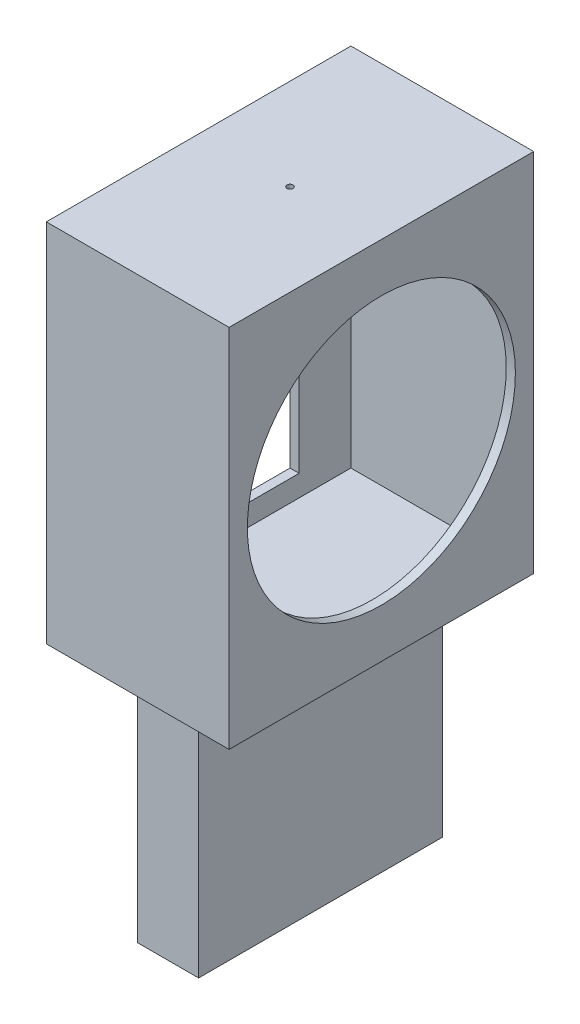
ISO-10303-21;
HEADER;
FILE_DESCRIPTION(('STEP AP214'),'2;1');
FILE_NAME('part.step','',(''),(''),'','','');
FILE_SCHEMA(('AUTOMOTIVE_DESIGN { 1 0 10303 214 1 1 1 1 }'));
ENDSEC;
DATA;
#1=APPLICATION_CONTEXT('core data for automotive mechanical design processes');
#2=APPLICATION_PROTOCOL_DEFINITION('international standard','automotive_design',2000,#1);
#3=PRODUCT_CONTEXT('',#1,'mechanical');
#4=PRODUCT('Part','Part','',(#3));
#5=PRODUCT_RELATED_PRODUCT_CATEGORY('part','',(#4));
#6=PRODUCT_DEFINITION_FORMATION('','',#4);
#7=PRODUCT_DEFINITION_CONTEXT('part definition',#1,'design');
#8=PRODUCT_DEFINITION('design','',#6,#7);
#9=PRODUCT_DEFINITION_SHAPE('','',#8);
#10=(LENGTH_UNIT() NAMED_UNIT(*) SI_UNIT(.MILLI.,.METRE.));
#11=(NAMED_UNIT(*) PLANE_ANGLE_UNIT() SI_UNIT($,.RADIAN.));
#12=(NAMED_UNIT(*) SI_UNIT($,.STERADIAN.) SOLID_ANGLE_UNIT());
#13=UNCERTAINTY_MEASURE_WITH_UNIT(LENGTH_MEASURE(1.E-05),#10,'distance_accuracy_value','');
#14=(GEOMETRIC_REPRESENTATION_CONTEXT(3) GLOBAL_UNCERTAINTY_ASSIGNED_CONTEXT((#13)) GLOBAL_UNIT_ASSIGNED_CONTEXT((#10,
#11,#12)) REPRESENTATION_CONTEXT('',''));
#15=CARTESIAN_POINT('',(0.,0.,0.));
#16=DIRECTION('',(0.,0.,1.));
#17=DIRECTION('',(1.,0.,0.));
#18=AXIS2_PLACEMENT_3D('',#15,#16,#17);
#19=CARTESIAN_POINT('',(138.,0.,40.));
#20=DIRECTION('',(0.,0.,-1.));
#21=DIRECTION('',(-1.,0.,0.));
#22=AXIS2_PLACEMENT_3D('',#19,#20,#21);
#23=PLANE('',#22);
#24=DIRECTION('',(0.,-1.,0.));
#25=VECTOR('',#24,1.);
#26=CARTESIAN_POINT('',(118.,0.,40.));
#27=LINE('',#26,#25);
#28=CARTESIAN_POINT('',(118.,80.,40.));
#29=VERTEX_POINT('',#28);
#30=CARTESIAN_POINT('',(118.,0.,40.));
#31=VERTEX_POINT('',#30);
#32=EDGE_CURVE('E114',#29,#31,#27,.T.);
#33=ORIENTED_EDGE('',*,*,#32,.T.);
#34=DIRECTION('',(-1.,0.,0.));
#35=VECTOR('',#34,1.);
#36=CARTESIAN_POINT('',(138.,0.,40.));
#37=LINE('',#36,#35);
#38=CARTESIAN_POINT('',(138.,0.,40.));
#39=VERTEX_POINT('',#38);
#40=EDGE_CURVE('E12',#39,#31,#37,.T.);
#41=ORIENTED_EDGE('',*,*,#40,.F.);
#42=DIRECTION('',(0.,-1.,0.));
#43=VECTOR('',#42,1.);
#44=CARTESIAN_POINT('',(138.,0.,40.));
#45=LINE('',#44,#43);
#46=CARTESIAN_POINT('',(138.,80.,40.));
#47=VERTEX_POINT('',#46);
#48=EDGE_CURVE('E102',#47,#39,#45,.T.);
#49=ORIENTED_EDGE('',*,*,#48,.F.);
#50=DIRECTION('',(-1.,0.,0.));
#51=VECTOR('',#50,1.);
#52=CARTESIAN_POINT('',(138.,80.,40.));
#53=LINE('',#52,#51);
#54=EDGE_CURVE('E110',#47,#29,#53,.T.);
#55=ORIENTED_EDGE('',*,*,#54,.T.);
#56=EDGE_LOOP('',(#33,#41,#49,#55));
#57=FACE_BOUND('',#56,.T.);
#58=ADVANCED_FACE('F51',(#57),#23,.F.);
#59=CARTESIAN_POINT('',(138.,0.,-40.));
#60=DIRECTION('',(0.,1.,0.));
#61=DIRECTION('',(0.,0.,1.));
#62=AXIS2_PLACEMENT_3D('',#59,#60,#61);
#63=PLANE('',#62);
#64=DIRECTION('',(0.,0.,-1.));
#65=VECTOR('',#64,1.);
#66=CARTESIAN_POINT('',(118.,0.,-40.));
#67=LINE('',#66,#65);
#68=CARTESIAN_POINT('',(118.,0.,-40.));
#69=VERTEX_POINT('',#68);
#70=EDGE_CURVE('E106',#31,#69,#67,.T.);
#71=ORIENTED_EDGE('',*,*,#70,.T.);
#72=DIRECTION('',(-1.,0.,0.));
#73=VECTOR('',#72,1.);
#74=CARTESIAN_POINT('',(138.,0.,-40.));
#75=LINE('',#74,#73);
#76=CARTESIAN_POINT('',(138.,0.,-40.));
#77=VERTEX_POINT('',#76);
#78=EDGE_CURVE('E59',#77,#69,#75,.T.);
#79=ORIENTED_EDGE('',*,*,#78,.F.);
#80=DIRECTION('',(0.,0.,-1.));
#81=VECTOR('',#80,1.);
#82=CARTESIAN_POINT('',(138.,0.,-40.));
#83=LINE('',#82,#81);
#84=EDGE_CURVE('E97',#39,#77,#83,.T.);
#85=ORIENTED_EDGE('',*,*,#84,.F.);
#86=ORIENTED_EDGE('',*,*,#40,.T.);
#87=EDGE_LOOP('',(#71,#79,#85,#86));
#88=FACE_BOUND('',#87,.T.);
#89=ADVANCED_FACE('F105',(#88),#63,.F.);
#90=CARTESIAN_POINT('',(138.,0.,-40.));
#91=DIRECTION('',(0.,0.,1.));
#92=DIRECTION('',(1.,0.,0.));
#93=AXIS2_PLACEMENT_3D('',#90,#91,#92);
#94=PLANE('',#93);
#95=DIRECTION('',(0.,1.,0.));
#96=VECTOR('',#95,1.);
#97=CARTESIAN_POINT('',(118.,0.,-40.));
#98=LINE('',#97,#96);
#99=CARTESIAN_POINT('',(118.,80.,-40.));
#100=VERTEX_POINT('',#99);
#101=EDGE_CURVE('E84',#69,#100,#98,.T.);
#102=ORIENTED_EDGE('',*,*,#101,.T.);
#103=DIRECTION('',(-1.,0.,0.));
#104=VECTOR('',#103,1.);
#105=CARTESIAN_POINT('',(138.,80.,-40.));
#106=LINE('',#105,#104);
#107=CARTESIAN_POINT('',(138.,80.,-40.));
#108=VERTEX_POINT('',#107);
#109=EDGE_CURVE('E107',#108,#100,#106,.T.);
#110=ORIENTED_EDGE('',*,*,#109,.F.);
#111=DIRECTION('',(0.,1.,0.));
#112=VECTOR('',#111,1.);
#113=CARTESIAN_POINT('',(138.,0.,-40.));
#114=LINE('',#113,#112);
#115=EDGE_CURVE('E100',#77,#108,#114,.T.);
#116=ORIENTED_EDGE('',*,*,#115,.F.);
#117=ORIENTED_EDGE('',*,*,#78,.T.);
#118=EDGE_LOOP('',(#102,#110,#116,#117));
#119=FACE_BOUND('',#118,.T.);
#120=ADVANCED_FACE('F108',(#119),#94,.F.);
#121=CARTESIAN_POINT('',(138.,80.,-40.));
#122=DIRECTION('',(0.,-1.,0.));
#123=DIRECTION('',(0.,0.,-1.));
#124=AXIS2_PLACEMENT_3D('',#121,#122,#123);
#125=PLANE('',#124);
#126=DIRECTION('',(0.,0.,1.));
#127=VECTOR('',#126,1.);
#128=CARTESIAN_POINT('',(118.,80.,-40.));
#129=LINE('',#128,#127);
#130=EDGE_CURVE('E90',#100,#29,#129,.T.);
#131=ORIENTED_EDGE('',*,*,#130,.T.);
#132=ORIENTED_EDGE('',*,*,#54,.F.);
#133=DIRECTION('',(0.,0.,1.));
#134=VECTOR('',#133,1.);
#135=CARTESIAN_POINT('',(138.,80.,-40.));
#136=LINE('',#135,#134);
#137=EDGE_CURVE('E67',#108,#47,#136,.T.);
#138=ORIENTED_EDGE('',*,*,#137,.F.);
#139=ORIENTED_EDGE('',*,*,#109,.T.);
#140=EDGE_LOOP('',(#131,#132,#138,#139));
#141=FACE_BOUND('',#140,.T.);
#142=ADVANCED_FACE('F121',(#141),#125,.F.);
#143=CARTESIAN_POINT('',(138.,0.,0.));
#144=DIRECTION('',(1.,0.,0.));
#145=DIRECTION('',(0.,0.,-1.));
#146=AXIS2_PLACEMENT_3D('',#143,#144,#145);
#147=PLANE('',#146);
#148=ORIENTED_EDGE('',*,*,#48,.T.);
#149=ORIENTED_EDGE('',*,*,#84,.T.);
#150=ORIENTED_EDGE('',*,*,#115,.T.);
#151=ORIENTED_EDGE('',*,*,#137,.T.);
#152=EDGE_LOOP('',(#148,#149,#150,#151));
#153=FACE_BOUND('',#152,.T.);
#154=ADVANCED_FACE('F98',(#153),#147,.T.);
#155=CARTESIAN_POINT('',(118.,0.,0.));
#156=DIRECTION('',(1.,0.,0.));
#157=DIRECTION('',(0.,0.,-1.));
#158=AXIS2_PLACEMENT_3D('',#155,#156,#157);
#159=PLANE('',#158);
#160=ORIENTED_EDGE('',*,*,#32,.F.);
#161=ORIENTED_EDGE('',*,*,#130,.F.);
#162=ORIENTED_EDGE('',*,*,#101,.F.);
#163=ORIENTED_EDGE('',*,*,#70,.F.);
#164=EDGE_LOOP('',(#160,#161,#162,#163));
#165=FACE_BOUND('',#164,.T.);
#166=ADVANCED_FACE('F124',(#165),#159,.F.);
#167=CLOSED_SHELL('',(#58,#89,#120,#142,#154,#166));
#168=MANIFOLD_SOLID_BREP('B2',#167);
#169=CARTESIAN_POINT('',(101.,0.,0.));
#170=DIRECTION('',(1.,0.,0.));
#171=DIRECTION('',(0.,0.,-1.));
#172=AXIS2_PLACEMENT_3D('',#169,#170,#171);
#173=PLANE('',#172);
#174=DIRECTION('',(0.,-1.,0.));
#175=VECTOR('',#174,1.);
#176=CARTESIAN_POINT('',(101.,83.,47.));
#177=LINE('',#176,#175);
#178=CARTESIAN_POINT('',(101.,197.,47.));
#179=VERTEX_POINT('',#178);
#180=CARTESIAN_POINT('',(101.,83.,47.));
#181=VERTEX_POINT('',#180);
#182=EDGE_CURVE('E310',#179,#181,#177,.T.);
#183=ORIENTED_EDGE('',*,*,#182,.T.);
#184=DIRECTION('',(0.,0.,-1.));
#185=VECTOR('',#184,1.);
#186=CARTESIAN_POINT('',(101.,83.,-47.));
#187=LINE('',#186,#185);
#188=CARTESIAN_POINT('',(101.,83.,-47.));
#189=VERTEX_POINT('',#188);
#190=EDGE_CURVE('E324',#181,#189,#187,.T.);
#191=ORIENTED_EDGE('',*,*,#190,.T.);
#192=DIRECTION('',(0.,1.,0.));
#193=VECTOR('',#192,1.);
#194=CARTESIAN_POINT('',(101.,83.,-47.));
#195=LINE('',#194,#193);
#196=CARTESIAN_POINT('',(101.,197.,-47.));
#197=VERTEX_POINT('',#196);
#198=EDGE_CURVE('E326',#189,#197,#195,.T.);
#199=ORIENTED_EDGE('',*,*,#198,.T.);
#200=DIRECTION('',(0.,0.,1.));
#201=VECTOR('',#200,1.);
#202=CARTESIAN_POINT('',(101.,197.,-47.));
#203=LINE('',#202,#201);
#204=EDGE_CURVE('E315',#197,#179,#203,.T.);
#205=ORIENTED_EDGE('',*,*,#204,.T.);
#206=EDGE_LOOP('',(#183,#191,#199,#205));
#207=FACE_BOUND('',#206,.T.);
#208=DIRECTION('',(0.,0.,1.));
#209=VECTOR('',#208,1.);
#210=CARTESIAN_POINT('',(101.,90.,0.));
#211=LINE('',#210,#209);
#212=CARTESIAN_POINT('',(101.,90.,-30.));
#213=VERTEX_POINT('',#212);
#214=CARTESIAN_POINT('',(101.,90.,30.));
#215=VERTEX_POINT('',#214);
#216=EDGE_CURVE('E184',#213,#215,#211,.T.);
#217=ORIENTED_EDGE('',*,*,#216,.T.);
#218=DIRECTION('',(0.,1.,0.));
#219=VECTOR('',#218,1.);
#220=CARTESIAN_POINT('',(101.,0.,30.));
#221=LINE('',#220,#219);
#222=CARTESIAN_POINT('',(101.,190.,30.));
#223=VERTEX_POINT('',#222);
#224=EDGE_CURVE('E49',#215,#223,#221,.T.);
#225=ORIENTED_EDGE('',*,*,#224,.T.);
#226=DIRECTION('',(0.,0.,-1.));
#227=VECTOR('',#226,1.);
#228=CARTESIAN_POINT('',(101.,190.,0.));
#229=LINE('',#228,#227);
#230=CARTESIAN_POINT('',(101.,190.,-30.));
#231=VERTEX_POINT('',#230);
#232=EDGE_CURVE('E263',#223,#231,#229,.T.);
#233=ORIENTED_EDGE('',*,*,#232,.T.);
#234=DIRECTION('',(0.,-1.,0.));
#235=VECTOR('',#234,1.);
#236=CARTESIAN_POINT('',(101.,0.,-30.));
#237=LINE('',#236,#235);
#238=EDGE_CURVE('E267',#231,#213,#237,.T.);
#239=ORIENTED_EDGE('',*,*,#238,.T.);
#240=EDGE_LOOP('',(#217,#225,#233,#239));
#241=FACE_BOUND('',#240,.T.);
#242=ADVANCED_FACE('F175',(#207,#241),#173,.T.);
#243=CARTESIAN_POINT('',(155.,83.,47.));
#244=DIRECTION('',(0.,0.,-1.));
#245=DIRECTION('',(-1.,0.,0.));
#246=AXIS2_PLACEMENT_3D('',#243,#244,#245);
#247=PLANE('',#246);
#248=ORIENTED_EDGE('',*,*,#182,.F.);
#249=DIRECTION('',(-1.,0.,0.));
#250=VECTOR('',#249,1.);
#251=CARTESIAN_POINT('',(155.,197.,47.));
#252=LINE('',#251,#250);
#253=CARTESIAN_POINT('',(155.,197.,47.));
#254=VERTEX_POINT('',#253);
#255=EDGE_CURVE('E321',#254,#179,#252,.T.);
#256=ORIENTED_EDGE('',*,*,#255,.F.);
#257=DIRECTION('',(0.,-1.,0.));
#258=VECTOR('',#257,1.);
#259=CARTESIAN_POINT('',(155.,83.,47.));
#260=LINE('',#259,#258);
#261=CARTESIAN_POINT('',(155.,83.,47.));
#262=VERTEX_POINT('',#261);
#263=EDGE_CURVE('E311',#254,#262,#260,.T.);
#264=ORIENTED_EDGE('',*,*,#263,.T.);
#265=DIRECTION('',(-1.,0.,0.));
#266=VECTOR('',#265,1.);
#267=CARTESIAN_POINT('',(155.,83.,47.));
#268=LINE('',#267,#266);
#269=EDGE_CURVE('E337',#262,#181,#268,.T.);
#270=ORIENTED_EDGE('',*,*,#269,.T.);
#271=EDGE_LOOP('',(#248,#256,#264,#270));
#272=FACE_BOUND('',#271,.T.);
#273=ADVANCED_FACE('F408',(#272),#247,.T.);
#274=CARTESIAN_POINT('',(155.,83.,-47.));
#275=DIRECTION('',(0.,1.,0.));
#276=DIRECTION('',(0.,0.,1.));
#277=AXIS2_PLACEMENT_3D('',#274,#275,#276);
#278=PLANE('',#277);
#279=ORIENTED_EDGE('',*,*,#190,.F.);
#280=ORIENTED_EDGE('',*,*,#269,.F.);
#281=DIRECTION('',(0.,0.,-1.));
#282=VECTOR('',#281,1.);
#283=CARTESIAN_POINT('',(155.,83.,-47.));
#284=LINE('',#283,#282);
#285=CARTESIAN_POINT('',(155.,83.,-47.));
#286=VERTEX_POINT('',#285);
#287=EDGE_CURVE('E314',#262,#286,#284,.T.);
#288=ORIENTED_EDGE('',*,*,#287,.T.);
#289=DIRECTION('',(-1.,0.,0.));
#290=VECTOR('',#289,1.);
#291=CARTESIAN_POINT('',(155.,83.,-47.));
#292=LINE('',#291,#290);
#293=EDGE_CURVE('E334',#286,#189,#292,.T.);
#294=ORIENTED_EDGE('',*,*,#293,.T.);
#295=EDGE_LOOP('',(#279,#280,#288,#294));
#296=FACE_BOUND('',#295,.T.);
#297=ADVANCED_FACE('F415',(#296),#278,.T.);
#298=CARTESIAN_POINT('',(155.,83.,-47.));
#299=DIRECTION('',(0.,0.,1.));
#300=DIRECTION('',(1.,0.,0.));
#301=AXIS2_PLACEMENT_3D('',#298,#299,#300);
#302=PLANE('',#301);
#303=ORIENTED_EDGE('',*,*,#198,.F.);
#304=ORIENTED_EDGE('',*,*,#293,.F.);
#305=DIRECTION('',(0.,1.,0.));
#306=VECTOR('',#305,1.);
#307=CARTESIAN_POINT('',(155.,83.,-47.));
#308=LINE('',#307,#306);
#309=CARTESIAN_POINT('',(155.,197.,-47.));
#310=VERTEX_POINT('',#309);
#311=EDGE_CURVE('E317',#286,#310,#308,.T.);
#312=ORIENTED_EDGE('',*,*,#311,.T.);
#313=DIRECTION('',(-1.,0.,0.));
#314=VECTOR('',#313,1.);
#315=CARTESIAN_POINT('',(155.,197.,-47.));
#316=LINE('',#315,#314);
#317=EDGE_CURVE('E331',#310,#197,#316,.T.);
#318=ORIENTED_EDGE('',*,*,#317,.T.);
#319=EDGE_LOOP('',(#303,#304,#312,#318));
#320=FACE_BOUND('',#319,.T.);
#321=ADVANCED_FACE('F424',(#320),#302,.T.);
#322=CARTESIAN_POINT('',(155.,197.,-47.));
#323=DIRECTION('',(0.,-1.,0.));
#324=DIRECTION('',(0.,0.,-1.));
#325=AXIS2_PLACEMENT_3D('',#322,#323,#324);
#326=PLANE('',#325);
#327=CARTESIAN_POINT('',(128.,197.,0.));
#328=DIRECTION('',(0.,-1.,0.));
#329=DIRECTION('',(0.,0.,-1.));
#330=AXIS2_PLACEMENT_3D('',#327,#328,#329);
#331=CIRCLE('',#330,1.);
#332=CARTESIAN_POINT('',(128.,197.,-1.));
#333=VERTEX_POINT('',#332);
#334=EDGE_CURVE('E287',#333,#333,#331,.F.);
#335=ORIENTED_EDGE('',*,*,#334,.T.);
#336=EDGE_LOOP('',(#335));
#337=FACE_BOUND('',#336,.T.);
#338=ORIENTED_EDGE('',*,*,#204,.F.);
#339=ORIENTED_EDGE('',*,*,#317,.F.);
#340=DIRECTION('',(0.,0.,1.));
#341=VECTOR('',#340,1.);
#342=CARTESIAN_POINT('',(155.,197.,-47.));
#343=LINE('',#342,#341);
#344=EDGE_CURVE('E319',#310,#254,#343,.T.);
#345=ORIENTED_EDGE('',*,*,#344,.T.);
#346=ORIENTED_EDGE('',*,*,#255,.T.);
#347=EDGE_LOOP('',(#338,#339,#345,#346));
#348=FACE_BOUND('',#347,.T.);
#349=ADVANCED_FACE('F421',(#337,#348),#326,.T.);
#350=CARTESIAN_POINT('',(155.,0.,0.));
#351=DIRECTION('',(1.,0.,0.));
#352=DIRECTION('',(0.,0.,-1.));
#353=AXIS2_PLACEMENT_3D('',#350,#351,#352);
#354=PLANE('',#353);
#355=CARTESIAN_POINT('',(155.,140.,0.));
#356=DIRECTION('',(1.,0.,0.));
#357=DIRECTION('',(0.,0.,-1.));
#358=AXIS2_PLACEMENT_3D('',#355,#356,#357);
#359=CIRCLE('',#358,44.);
#360=CARTESIAN_POINT('',(155.,140.,-44.));
#361=VERTEX_POINT('',#360);
#362=EDGE_CURVE('E277',#361,#361,#359,.F.);
#363=ORIENTED_EDGE('',*,*,#362,.F.);
#364=EDGE_LOOP('',(#363));
#365=FACE_BOUND('',#364,.T.);
#366=ORIENTED_EDGE('',*,*,#263,.F.);
#367=ORIENTED_EDGE('',*,*,#344,.F.);
#368=ORIENTED_EDGE('',*,*,#311,.F.);
#369=ORIENTED_EDGE('',*,*,#287,.F.);
#370=EDGE_LOOP('',(#366,#367,#368,#369));
#371=FACE_BOUND('',#370,.T.);
#372=ADVANCED_FACE('F419',(#365,#371),#354,.F.);
#373=CARTESIAN_POINT('',(102.,90.,30.));
#374=DIRECTION('',(0.,0.,-1.));
#375=DIRECTION('',(-1.,0.,0.));
#376=AXIS2_PLACEMENT_3D('',#373,#374,#375);
#377=PLANE('',#376);
#378=DIRECTION('',(0.,1.,0.));
#379=VECTOR('',#378,1.);
#380=CARTESIAN_POINT('',(98.,0.,30.));
#381=LINE('',#380,#379);
#382=CARTESIAN_POINT('',(98.,90.,30.));
#383=VERTEX_POINT('',#382);
#384=CARTESIAN_POINT('',(98.,190.,30.));
#385=VERTEX_POINT('',#384);
#386=EDGE_CURVE('E275',#383,#385,#381,.T.);
#387=ORIENTED_EDGE('',*,*,#386,.T.);
#388=DIRECTION('',(-1.,0.,0.));
#389=VECTOR('',#388,1.);
#390=CARTESIAN_POINT('',(102.,190.,30.));
#391=LINE('',#390,#389);
#392=EDGE_CURVE('E192',#223,#385,#391,.T.);
#393=ORIENTED_EDGE('',*,*,#392,.F.);
#394=ORIENTED_EDGE('',*,*,#224,.F.);
#395=DIRECTION('',(-1.,0.,0.));
#396=VECTOR('',#395,1.);
#397=CARTESIAN_POINT('',(102.,90.,30.));
#398=LINE('',#397,#396);
#399=EDGE_CURVE('E301',#215,#383,#398,.T.);
#400=ORIENTED_EDGE('',*,*,#399,.T.);
#401=EDGE_LOOP('',(#387,#393,#394,#400));
#402=FACE_BOUND('',#401,.T.);
#403=ADVANCED_FACE('F271',(#402),#377,.T.);
#404=CARTESIAN_POINT('',(102.,90.,-30.));
#405=DIRECTION('',(0.,1.,0.));
#406=DIRECTION('',(0.,0.,1.));
#407=AXIS2_PLACEMENT_3D('',#404,#405,#406);
#408=PLANE('',#407);
#409=DIRECTION('',(0.,0.,1.));
#410=VECTOR('',#409,1.);
#411=CARTESIAN_POINT('',(98.,90.,0.));
#412=LINE('',#411,#410);
#413=CARTESIAN_POINT('',(98.,90.,-30.));
#414=VERTEX_POINT('',#413);
#415=EDGE_CURVE('E307',#414,#383,#412,.T.);
#416=ORIENTED_EDGE('',*,*,#415,.T.);
#417=ORIENTED_EDGE('',*,*,#399,.F.);
#418=ORIENTED_EDGE('',*,*,#216,.F.);
#419=DIRECTION('',(-1.,0.,0.));
#420=VECTOR('',#419,1.);
#421=CARTESIAN_POINT('',(102.,90.,-30.));
#422=LINE('',#421,#420);
#423=EDGE_CURVE('E299',#213,#414,#422,.T.);
#424=ORIENTED_EDGE('',*,*,#423,.T.);
#425=EDGE_LOOP('',(#416,#417,#418,#424));
#426=FACE_BOUND('',#425,.T.);
#427=ADVANCED_FACE('F452',(#426),#408,.T.);
#428=CARTESIAN_POINT('',(102.,90.,-30.));
#429=DIRECTION('',(0.,0.,1.));
#430=DIRECTION('',(1.,0.,0.));
#431=AXIS2_PLACEMENT_3D('',#428,#429,#430);
#432=PLANE('',#431);
#433=DIRECTION('',(0.,-1.,0.));
#434=VECTOR('',#433,1.);
#435=CARTESIAN_POINT('',(98.,0.,-30.));
#436=LINE('',#435,#434);
#437=CARTESIAN_POINT('',(98.,190.,-30.));
#438=VERTEX_POINT('',#437);
#439=EDGE_CURVE('E305',#438,#414,#436,.T.);
#440=ORIENTED_EDGE('',*,*,#439,.T.);
#441=ORIENTED_EDGE('',*,*,#423,.F.);
#442=ORIENTED_EDGE('',*,*,#238,.F.);
#443=DIRECTION('',(-1.,0.,0.));
#444=VECTOR('',#443,1.);
#445=CARTESIAN_POINT('',(102.,190.,-30.));
#446=LINE('',#445,#444);
#447=EDGE_CURVE('E197',#231,#438,#446,.T.);
#448=ORIENTED_EDGE('',*,*,#447,.T.);
#449=EDGE_LOOP('',(#440,#441,#442,#448));
#450=FACE_BOUND('',#449,.T.);
#451=ADVANCED_FACE('F460',(#450),#432,.T.);
#452=CARTESIAN_POINT('',(102.,190.,-30.));
#453=DIRECTION('',(0.,-1.,0.));
#454=DIRECTION('',(0.,0.,-1.));
#455=AXIS2_PLACEMENT_3D('',#452,#453,#454);
#456=PLANE('',#455);
#457=DIRECTION('',(0.,0.,-1.));
#458=VECTOR('',#457,1.);
#459=CARTESIAN_POINT('',(98.,190.,0.));
#460=LINE('',#459,#458);
#461=EDGE_CURVE('E303',#385,#438,#460,.T.);
#462=ORIENTED_EDGE('',*,*,#461,.T.);
#463=ORIENTED_EDGE('',*,*,#447,.F.);
#464=ORIENTED_EDGE('',*,*,#232,.F.);
#465=ORIENTED_EDGE('',*,*,#392,.T.);
#466=EDGE_LOOP('',(#462,#463,#464,#465));
#467=FACE_BOUND('',#466,.T.);
#468=ADVANCED_FACE('F264',(#467),#456,.T.);
#469=CARTESIAN_POINT('',(98.,0.,0.));
#470=DIRECTION('',(1.,0.,0.));
#471=DIRECTION('',(0.,0.,-1.));
#472=AXIS2_PLACEMENT_3D('',#469,#470,#471);
#473=PLANE('',#472);
#474=DIRECTION('',(0.,-1.,0.));
#475=VECTOR('',#474,1.);
#476=CARTESIAN_POINT('',(98.,80.,50.));
#477=LINE('',#476,#475);
#478=CARTESIAN_POINT('',(98.,200.,50.));
#479=VERTEX_POINT('',#478);
#480=CARTESIAN_POINT('',(98.,80.,50.));
#481=VERTEX_POINT('',#480);
#482=EDGE_CURVE('E340',#479,#481,#477,.T.);
#483=ORIENTED_EDGE('',*,*,#482,.F.);
#484=DIRECTION('',(0.,0.,1.));
#485=VECTOR('',#484,1.);
#486=CARTESIAN_POINT('',(98.,200.,-50.));
#487=LINE('',#486,#485);
#488=CARTESIAN_POINT('',(98.,200.,-50.));
#489=VERTEX_POINT('',#488);
#490=EDGE_CURVE('E345',#489,#479,#487,.T.);
#491=ORIENTED_EDGE('',*,*,#490,.F.);
#492=DIRECTION('',(0.,1.,0.));
#493=VECTOR('',#492,1.);
#494=CARTESIAN_POINT('',(98.,80.,-50.));
#495=LINE('',#494,#493);
#496=CARTESIAN_POINT('',(98.,80.,-50.));
#497=VERTEX_POINT('',#496);
#498=EDGE_CURVE('E356',#497,#489,#495,.T.);
#499=ORIENTED_EDGE('',*,*,#498,.F.);
#500=DIRECTION('',(0.,0.,-1.));
#501=VECTOR('',#500,1.);
#502=CARTESIAN_POINT('',(98.,80.,-50.));
#503=LINE('',#502,#501);
#504=EDGE_CURVE('E354',#481,#497,#503,.T.);
#505=ORIENTED_EDGE('',*,*,#504,.F.);
#506=EDGE_LOOP('',(#483,#491,#499,#505));
#507=FACE_BOUND('',#506,.T.);
#508=ORIENTED_EDGE('',*,*,#386,.F.);
#509=ORIENTED_EDGE('',*,*,#415,.F.);
#510=ORIENTED_EDGE('',*,*,#439,.F.);
#511=ORIENTED_EDGE('',*,*,#461,.F.);
#512=EDGE_LOOP('',(#508,#509,#510,#511));
#513=FACE_BOUND('',#512,.T.);
#514=ADVANCED_FACE('F378',(#507,#513),#473,.F.);
#515=CARTESIAN_POINT('',(158.,80.,50.));
#516=DIRECTION('',(0.,0.,-1.));
#517=DIRECTION('',(-1.,0.,0.));
#518=AXIS2_PLACEMENT_3D('',#515,#516,#517);
#519=PLANE('',#518);
#520=ORIENTED_EDGE('',*,*,#482,.T.);
#521=DIRECTION('',(-1.,0.,0.));
#522=VECTOR('',#521,1.);
#523=CARTESIAN_POINT('',(158.,80.,50.));
#524=LINE('',#523,#522);
#525=CARTESIAN_POINT('',(158.,80.,50.));
#526=VERTEX_POINT('',#525);
#527=EDGE_CURVE('E268',#526,#481,#524,.T.);
#528=ORIENTED_EDGE('',*,*,#527,.F.);
#529=DIRECTION('',(0.,-1.,0.));
#530=VECTOR('',#529,1.);
#531=CARTESIAN_POINT('',(158.,80.,50.));
#532=LINE('',#531,#530);
#533=CARTESIAN_POINT('',(158.,200.,50.));
#534=VERTEX_POINT('',#533);
#535=EDGE_CURVE('E341',#534,#526,#532,.T.);
#536=ORIENTED_EDGE('',*,*,#535,.F.);
#537=DIRECTION('',(-1.,0.,0.));
#538=VECTOR('',#537,1.);
#539=CARTESIAN_POINT('',(158.,200.,50.));
#540=LINE('',#539,#538);
#541=EDGE_CURVE('E351',#534,#479,#540,.T.);
#542=ORIENTED_EDGE('',*,*,#541,.T.);
#543=EDGE_LOOP('',(#520,#528,#536,#542));
#544=FACE_BOUND('',#543,.T.);
#545=ADVANCED_FACE('F177',(#544),#519,.F.);
#546=CARTESIAN_POINT('',(158.,80.,-50.));
#547=DIRECTION('',(0.,1.,0.));
#548=DIRECTION('',(0.,0.,1.));
#549=AXIS2_PLACEMENT_3D('',#546,#547,#548);
#550=PLANE('',#549);
#551=ORIENTED_EDGE('',*,*,#504,.T.);
#552=DIRECTION('',(-1.,0.,0.));
#553=VECTOR('',#552,1.);
#554=CARTESIAN_POINT('',(158.,80.,-50.));
#555=LINE('',#554,#553);
#556=CARTESIAN_POINT('',(158.,80.,-50.));
#557=VERTEX_POINT('',#556);
#558=EDGE_CURVE('E364',#557,#497,#555,.T.);
#559=ORIENTED_EDGE('',*,*,#558,.F.);
#560=DIRECTION('',(0.,0.,-1.));
#561=VECTOR('',#560,1.);
#562=CARTESIAN_POINT('',(158.,80.,-50.));
#563=LINE('',#562,#561);
#564=EDGE_CURVE('E344',#526,#557,#563,.T.);
#565=ORIENTED_EDGE('',*,*,#564,.F.);
#566=ORIENTED_EDGE('',*,*,#527,.T.);
#567=EDGE_LOOP('',(#551,#559,#565,#566));
#568=FACE_BOUND('',#567,.T.);
#569=ADVANCED_FACE('F370',(#568),#550,.F.);
#570=CARTESIAN_POINT('',(158.,80.,-50.));
#571=DIRECTION('',(0.,0.,1.));
#572=DIRECTION('',(1.,0.,0.));
#573=AXIS2_PLACEMENT_3D('',#570,#571,#572);
#574=PLANE('',#573);
#575=ORIENTED_EDGE('',*,*,#498,.T.);
#576=DIRECTION('',(-1.,0.,0.));
#577=VECTOR('',#576,1.);
#578=CARTESIAN_POINT('',(158.,200.,-50.));
#579=LINE('',#578,#577);
#580=CARTESIAN_POINT('',(158.,200.,-50.));
#581=VERTEX_POINT('',#580);
#582=EDGE_CURVE('E361',#581,#489,#579,.T.);
#583=ORIENTED_EDGE('',*,*,#582,.F.);
#584=DIRECTION('',(0.,1.,0.));
#585=VECTOR('',#584,1.);
#586=CARTESIAN_POINT('',(158.,80.,-50.));
#587=LINE('',#586,#585);
#588=EDGE_CURVE('E347',#557,#581,#587,.T.);
#589=ORIENTED_EDGE('',*,*,#588,.F.);
#590=ORIENTED_EDGE('',*,*,#558,.T.);
#591=EDGE_LOOP('',(#575,#583,#589,#590));
#592=FACE_BOUND('',#591,.T.);
#593=ADVANCED_FACE('F383',(#592),#574,.F.);
#594=CARTESIAN_POINT('',(158.,200.,-50.));
#595=DIRECTION('',(0.,-1.,0.));
#596=DIRECTION('',(0.,0.,-1.));
#597=AXIS2_PLACEMENT_3D('',#594,#595,#596);
#598=PLANE('',#597);
#599=CARTESIAN_POINT('',(128.,200.,0.));
#600=DIRECTION('',(0.,-1.,0.));
#601=DIRECTION('',(0.,0.,-1.));
#602=AXIS2_PLACEMENT_3D('',#599,#600,#601);
#603=CIRCLE('',#602,1.);
#604=CARTESIAN_POINT('',(128.,200.,-1.));
#605=VERTEX_POINT('',#604);
#606=EDGE_CURVE('E179',#605,#605,#603,.F.);
#607=ORIENTED_EDGE('',*,*,#606,.F.);
#608=EDGE_LOOP('',(#607));
#609=FACE_BOUND('',#608,.T.);
#610=ORIENTED_EDGE('',*,*,#490,.T.);
#611=ORIENTED_EDGE('',*,*,#541,.F.);
#612=DIRECTION('',(0.,0.,1.));
#613=VECTOR('',#612,1.);
#614=CARTESIAN_POINT('',(158.,200.,-50.));
#615=LINE('',#614,#613);
#616=EDGE_CURVE('E349',#581,#534,#615,.T.);
#617=ORIENTED_EDGE('',*,*,#616,.F.);
#618=ORIENTED_EDGE('',*,*,#582,.T.);
#619=EDGE_LOOP('',(#610,#611,#617,#618));
#620=FACE_BOUND('',#619,.T.);
#621=ADVANCED_FACE('F387',(#609,#620),#598,.F.);
#622=CARTESIAN_POINT('',(158.,0.,0.));
#623=DIRECTION('',(1.,0.,0.));
#624=DIRECTION('',(0.,0.,-1.));
#625=AXIS2_PLACEMENT_3D('',#622,#623,#624);
#626=PLANE('',#625);
#627=CARTESIAN_POINT('',(158.,140.,0.));
#628=DIRECTION('',(1.,0.,0.));
#629=DIRECTION('',(0.,0.,-1.));
#630=AXIS2_PLACEMENT_3D('',#627,#628,#629);
#631=CIRCLE('',#630,44.);
#632=CARTESIAN_POINT('',(158.,140.,-44.));
#633=VERTEX_POINT('',#632);
#634=EDGE_CURVE('E285',#633,#633,#631,.F.);
#635=ORIENTED_EDGE('',*,*,#634,.T.);
#636=EDGE_LOOP('',(#635));
#637=FACE_BOUND('',#636,.T.);
#638=ORIENTED_EDGE('',*,*,#535,.T.);
#639=ORIENTED_EDGE('',*,*,#564,.T.);
#640=ORIENTED_EDGE('',*,*,#588,.T.);
#641=ORIENTED_EDGE('',*,*,#616,.T.);
#642=EDGE_LOOP('',(#638,#639,#640,#641));
#643=FACE_BOUND('',#642,.T.);
#644=ADVANCED_FACE('F389',(#637,#643),#626,.T.);
#645=CARTESIAN_POINT('',(159.,140.,0.));
#646=DIRECTION('',(-1.,0.,0.));
#647=DIRECTION('',(0.,0.,1.));
#648=AXIS2_PLACEMENT_3D('',#645,#646,#647);
#649=CYLINDRICAL_SURFACE('',#648,44.);
#650=ORIENTED_EDGE('',*,*,#634,.F.);
#651=EDGE_LOOP('',(#650));
#652=FACE_BOUND('',#651,.T.);
#653=ORIENTED_EDGE('',*,*,#362,.T.);
#654=EDGE_LOOP('',(#653));
#655=FACE_BOUND('',#654,.T.);
#656=ADVANCED_FACE('F391',(#652,#655),#649,.F.);
#657=CARTESIAN_POINT('',(128.,201.,0.));
#658=DIRECTION('',(0.,-1.,0.));
#659=DIRECTION('',(0.,0.,-1.));
#660=AXIS2_PLACEMENT_3D('',#657,#658,#659);
#661=CYLINDRICAL_SURFACE('',#660,1.);
#662=ORIENTED_EDGE('',*,*,#334,.F.);
#663=EDGE_LOOP('',(#662));
#664=FACE_BOUND('',#663,.T.);
#665=ORIENTED_EDGE('',*,*,#606,.T.);
#666=EDGE_LOOP('',(#665));
#667=FACE_BOUND('',#666,.T.);
#668=ADVANCED_FACE('F399',(#664,#667),#661,.F.);
#669=CLOSED_SHELL('',(#242,#273,#297,#321,#349,#372,#403,#427,#451,#468,#514,#545,#569,#593,
#621,#644,#656,#668));
#670=MANIFOLD_SOLID_BREP('B6',#669);
#671=ADVANCED_BREP_SHAPE_REPRESENTATION('',(#18,#168,#670),#14);
#672=SHAPE_DEFINITION_REPRESENTATION(#9,#671);
ENDSEC;
END-ISO-10303-21;
